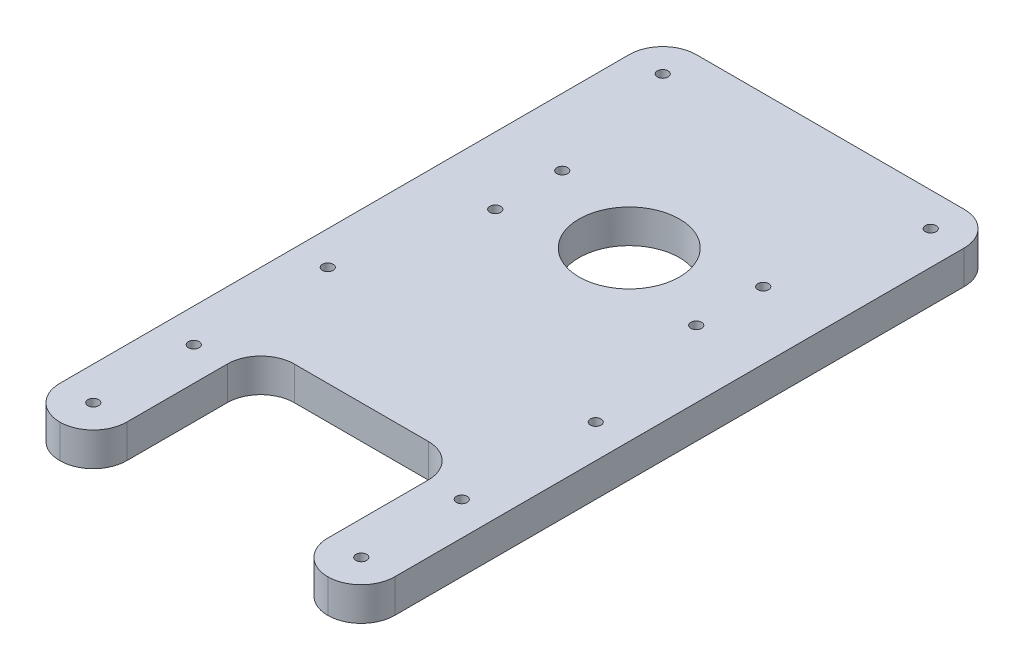
ISO-10303-21;
HEADER;
FILE_DESCRIPTION(('STEP AP214'),'2;1');
FILE_NAME('part.step','',(''),(''),'','','');
FILE_SCHEMA(('AUTOMOTIVE_DESIGN { 1 0 10303 214 1 1 1 1 }'));
ENDSEC;
DATA;
#1=APPLICATION_CONTEXT('core data for automotive mechanical design processes');
#2=APPLICATION_PROTOCOL_DEFINITION('international standard','automotive_design',2000,#1);
#3=PRODUCT_CONTEXT('',#1,'mechanical');
#4=PRODUCT('Part','Part','',(#3));
#5=PRODUCT_RELATED_PRODUCT_CATEGORY('part','',(#4));
#6=PRODUCT_DEFINITION_FORMATION('','',#4);
#7=PRODUCT_DEFINITION_CONTEXT('part definition',#1,'design');
#8=PRODUCT_DEFINITION('design','',#6,#7);
#9=PRODUCT_DEFINITION_SHAPE('','',#8);
#10=(LENGTH_UNIT() NAMED_UNIT(*) SI_UNIT(.MILLI.,.METRE.));
#11=(NAMED_UNIT(*) PLANE_ANGLE_UNIT() SI_UNIT($,.RADIAN.));
#12=(NAMED_UNIT(*) SI_UNIT($,.STERADIAN.) SOLID_ANGLE_UNIT());
#13=UNCERTAINTY_MEASURE_WITH_UNIT(LENGTH_MEASURE(1.E-05),#10,'distance_accuracy_value','');
#14=(GEOMETRIC_REPRESENTATION_CONTEXT(3) GLOBAL_UNCERTAINTY_ASSIGNED_CONTEXT((#13)) GLOBAL_UNIT_ASSIGNED_CONTEXT((#10,
#11,#12)) REPRESENTATION_CONTEXT('',''));
#15=CARTESIAN_POINT('',(0.,0.,0.));
#16=DIRECTION('',(0.,0.,1.));
#17=DIRECTION('',(1.,0.,0.));
#18=AXIS2_PLACEMENT_3D('',#15,#16,#17);
#19=CARTESIAN_POINT('',(50.,10.,-60.));
#20=DIRECTION('',(-1.,0.,0.));
#21=DIRECTION('',(0.,0.,1.));
#22=AXIS2_PLACEMENT_3D('',#19,#20,#21);
#23=PLANE('',#22);
#24=DIRECTION('',(0.,0.,-1.));
#25=VECTOR('',#24,1.);
#26=CARTESIAN_POINT('',(50.,0.,-60.));
#27=LINE('',#26,#25);
#28=CARTESIAN_POINT('',(50.,0.,120.));
#29=VERTEX_POINT('',#28);
#30=CARTESIAN_POINT('',(50.,0.,-50.));
#31=VERTEX_POINT('',#30);
#32=EDGE_CURVE('E376',#29,#31,#27,.T.);
#33=ORIENTED_EDGE('',*,*,#32,.T.);
#34=DIRECTION('',(0.,-1.,0.));
#35=VECTOR('',#34,1.);
#36=CARTESIAN_POINT('',(50.,10.,-50.));
#37=LINE('',#36,#35);
#38=CARTESIAN_POINT('',(50.,10.,-50.));
#39=VERTEX_POINT('',#38);
#40=EDGE_CURVE('E227',#31,#39,#37,.F.);
#41=ORIENTED_EDGE('',*,*,#40,.T.);
#42=DIRECTION('',(0.,0.,-1.));
#43=VECTOR('',#42,1.);
#44=CARTESIAN_POINT('',(50.,10.,130.));
#45=LINE('',#44,#43);
#46=CARTESIAN_POINT('',(50.,10.,120.));
#47=VERTEX_POINT('',#46);
#48=EDGE_CURVE('E377',#47,#39,#45,.T.);
#49=ORIENTED_EDGE('',*,*,#48,.F.);
#50=DIRECTION('',(0.,-1.,0.));
#51=VECTOR('',#50,1.);
#52=CARTESIAN_POINT('',(50.,10.,120.));
#53=LINE('',#52,#51);
#54=EDGE_CURVE('E223',#47,#29,#53,.T.);
#55=ORIENTED_EDGE('',*,*,#54,.T.);
#56=EDGE_LOOP('',(#33,#41,#49,#55));
#57=FACE_BOUND('',#56,.T.);
#58=ADVANCED_FACE('F47',(#57),#23,.F.);
#59=CARTESIAN_POINT('',(-50.,10.,-60.));
#60=DIRECTION('',(0.,0.,1.));
#61=DIRECTION('',(1.,0.,0.));
#62=AXIS2_PLACEMENT_3D('',#59,#60,#61);
#63=PLANE('',#62);
#64=DIRECTION('',(-1.,0.,0.));
#65=VECTOR('',#64,1.);
#66=CARTESIAN_POINT('',(-50.,10.,-60.));
#67=LINE('',#66,#65);
#68=CARTESIAN_POINT('',(40.,10.,-60.));
#69=VERTEX_POINT('',#68);
#70=CARTESIAN_POINT('',(-40.,10.,-60.));
#71=VERTEX_POINT('',#70);
#72=EDGE_CURVE('E381',#69,#71,#67,.T.);
#73=ORIENTED_EDGE('',*,*,#72,.F.);
#74=DIRECTION('',(0.,-1.,0.));
#75=VECTOR('',#74,1.);
#76=CARTESIAN_POINT('',(40.,10.,-60.));
#77=LINE('',#76,#75);
#78=CARTESIAN_POINT('',(40.,0.,-60.));
#79=VERTEX_POINT('',#78);
#80=EDGE_CURVE('E201',#69,#79,#77,.T.);
#81=ORIENTED_EDGE('',*,*,#80,.T.);
#82=DIRECTION('',(-1.,0.,0.));
#83=VECTOR('',#82,1.);
#84=CARTESIAN_POINT('',(-50.,0.,-60.));
#85=LINE('',#84,#83);
#86=CARTESIAN_POINT('',(-40.,0.,-60.));
#87=VERTEX_POINT('',#86);
#88=EDGE_CURVE('E391',#79,#87,#85,.T.);
#89=ORIENTED_EDGE('',*,*,#88,.T.);
#90=DIRECTION('',(0.,-1.,0.));
#91=VECTOR('',#90,1.);
#92=CARTESIAN_POINT('',(-40.,10.,-60.));
#93=LINE('',#92,#91);
#94=EDGE_CURVE('E198',#87,#71,#93,.F.);
#95=ORIENTED_EDGE('',*,*,#94,.T.);
#96=EDGE_LOOP('',(#73,#81,#89,#95));
#97=FACE_BOUND('',#96,.T.);
#98=ADVANCED_FACE('F424',(#97),#63,.F.);
#99=CARTESIAN_POINT('',(-50.,10.,60.));
#100=DIRECTION('',(1.,0.,0.));
#101=DIRECTION('',(0.,0.,-1.));
#102=AXIS2_PLACEMENT_3D('',#99,#100,#101);
#103=PLANE('',#102);
#104=DIRECTION('',(0.,0.,1.));
#105=VECTOR('',#104,1.);
#106=CARTESIAN_POINT('',(-50.,10.,-60.));
#107=LINE('',#106,#105);
#108=CARTESIAN_POINT('',(-50.,10.,-50.));
#109=VERTEX_POINT('',#108);
#110=CARTESIAN_POINT('',(-50.,10.,120.));
#111=VERTEX_POINT('',#110);
#112=EDGE_CURVE('E185',#109,#111,#107,.T.);
#113=ORIENTED_EDGE('',*,*,#112,.F.);
#114=DIRECTION('',(0.,-1.,0.));
#115=VECTOR('',#114,1.);
#116=CARTESIAN_POINT('',(-50.,10.,-50.));
#117=LINE('',#116,#115);
#118=CARTESIAN_POINT('',(-50.,0.,-50.));
#119=VERTEX_POINT('',#118);
#120=EDGE_CURVE('E250',#109,#119,#117,.T.);
#121=ORIENTED_EDGE('',*,*,#120,.T.);
#122=DIRECTION('',(0.,0.,1.));
#123=VECTOR('',#122,1.);
#124=CARTESIAN_POINT('',(-50.,0.,60.));
#125=LINE('',#124,#123);
#126=CARTESIAN_POINT('',(-50.,0.,120.));
#127=VERTEX_POINT('',#126);
#128=EDGE_CURVE('E382',#119,#127,#125,.T.);
#129=ORIENTED_EDGE('',*,*,#128,.T.);
#130=DIRECTION('',(0.,-1.,0.));
#131=VECTOR('',#130,1.);
#132=CARTESIAN_POINT('',(-50.,10.,120.));
#133=LINE('',#132,#131);
#134=EDGE_CURVE('E247',#127,#111,#133,.F.);
#135=ORIENTED_EDGE('',*,*,#134,.T.);
#136=EDGE_LOOP('',(#113,#121,#129,#135));
#137=FACE_BOUND('',#136,.T.);
#138=ADVANCED_FACE('F399',(#137),#103,.F.);
#139=CARTESIAN_POINT('',(0.,10.,0.));
#140=DIRECTION('',(0.,-1.,0.));
#141=DIRECTION('',(0.,0.,-1.));
#142=AXIS2_PLACEMENT_3D('',#139,#140,#141);
#143=PLANE('',#142);
#144=CARTESIAN_POINT('',(-30.,10.,10.));
#145=DIRECTION('',(0.,-1.,0.));
#146=DIRECTION('',(0.,0.,-1.));
#147=AXIS2_PLACEMENT_3D('',#144,#145,#146);
#148=CIRCLE('',#147,1.6);
#149=CARTESIAN_POINT('',(-30.,10.,8.4));
#150=VERTEX_POINT('',#149);
#151=EDGE_CURVE('E283',#150,#150,#148,.T.);
#152=ORIENTED_EDGE('',*,*,#151,.T.);
#153=EDGE_LOOP('',(#152));
#154=FACE_BOUND('',#153,.T.);
#155=CARTESIAN_POINT('',(30.,10.,-10.));
#156=DIRECTION('',(0.,-1.,0.));
#157=DIRECTION('',(0.,0.,-1.));
#158=AXIS2_PLACEMENT_3D('',#155,#156,#157);
#159=CIRCLE('',#158,1.6);
#160=CARTESIAN_POINT('',(30.,10.,-11.6));
#161=VERTEX_POINT('',#160);
#162=EDGE_CURVE('E287',#161,#161,#159,.T.);
#163=ORIENTED_EDGE('',*,*,#162,.T.);
#164=EDGE_LOOP('',(#163));
#165=FACE_BOUND('',#164,.T.);
#166=CARTESIAN_POINT('',(30.,10.,10.));
#167=DIRECTION('',(0.,-1.,0.));
#168=DIRECTION('',(0.,0.,-1.));
#169=AXIS2_PLACEMENT_3D('',#166,#167,#168);
#170=CIRCLE('',#169,1.6);
#171=CARTESIAN_POINT('',(30.,10.,8.4));
#172=VERTEX_POINT('',#171);
#173=EDGE_CURVE('E687',#172,#172,#170,.T.);
#174=ORIENTED_EDGE('',*,*,#173,.T.);
#175=EDGE_LOOP('',(#174));
#176=FACE_BOUND('',#175,.T.);
#177=CARTESIAN_POINT('',(-30.,10.,-10.));
#178=DIRECTION('',(0.,-1.,0.));
#179=DIRECTION('',(0.,0.,-1.));
#180=AXIS2_PLACEMENT_3D('',#177,#178,#179);
#181=CIRCLE('',#180,1.6);
#182=CARTESIAN_POINT('',(-30.,10.,-11.6));
#183=VERTEX_POINT('',#182);
#184=EDGE_CURVE('E691',#183,#183,#181,.T.);
#185=ORIENTED_EDGE('',*,*,#184,.T.);
#186=EDGE_LOOP('',(#185));
#187=FACE_BOUND('',#186,.T.);
#188=CARTESIAN_POINT('',(40.,10.,90.));
#189=DIRECTION('',(0.,-1.,0.));
#190=DIRECTION('',(0.,0.,-1.));
#191=AXIS2_PLACEMENT_3D('',#188,#189,#190);
#192=CIRCLE('',#191,1.6);
#193=CARTESIAN_POINT('',(40.,10.,88.4));
#194=VERTEX_POINT('',#193);
#195=EDGE_CURVE('E372',#194,#194,#192,.T.);
#196=ORIENTED_EDGE('',*,*,#195,.T.);
#197=EDGE_LOOP('',(#196));
#198=FACE_BOUND('',#197,.T.);
#199=CARTESIAN_POINT('',(-40.,10.,90.));
#200=DIRECTION('',(0.,-1.,0.));
#201=DIRECTION('',(0.,0.,-1.));
#202=AXIS2_PLACEMENT_3D('',#199,#200,#201);
#203=CIRCLE('',#202,1.6);
#204=CARTESIAN_POINT('',(-40.,10.,88.4));
#205=VERTEX_POINT('',#204);
#206=EDGE_CURVE('E368',#205,#205,#203,.T.);
#207=ORIENTED_EDGE('',*,*,#206,.T.);
#208=EDGE_LOOP('',(#207));
#209=FACE_BOUND('',#208,.T.);
#210=CARTESIAN_POINT('',(40.,10.,120.));
#211=DIRECTION('',(0.,-1.,0.));
#212=DIRECTION('',(0.,0.,-1.));
#213=AXIS2_PLACEMENT_3D('',#210,#211,#212);
#214=CIRCLE('',#213,1.6);
#215=CARTESIAN_POINT('',(40.,10.,118.4));
#216=VERTEX_POINT('',#215);
#217=EDGE_CURVE('E364',#216,#216,#214,.T.);
#218=ORIENTED_EDGE('',*,*,#217,.T.);
#219=EDGE_LOOP('',(#218));
#220=FACE_BOUND('',#219,.T.);
#221=CARTESIAN_POINT('',(-40.,10.,120.));
#222=DIRECTION('',(0.,-1.,0.));
#223=DIRECTION('',(0.,0.,-1.));
#224=AXIS2_PLACEMENT_3D('',#221,#222,#223);
#225=CIRCLE('',#224,1.6);
#226=CARTESIAN_POINT('',(-40.,10.,118.4));
#227=VERTEX_POINT('',#226);
#228=EDGE_CURVE('E360',#227,#227,#225,.T.);
#229=ORIENTED_EDGE('',*,*,#228,.T.);
#230=EDGE_LOOP('',(#229));
#231=FACE_BOUND('',#230,.T.);
#232=CARTESIAN_POINT('',(-40.,10.,-50.));
#233=DIRECTION('',(0.,-1.,0.));
#234=DIRECTION('',(0.,0.,-1.));
#235=AXIS2_PLACEMENT_3D('',#232,#233,#234);
#236=CIRCLE('',#235,1.6);
#237=CARTESIAN_POINT('',(-40.,10.,-51.6));
#238=VERTEX_POINT('',#237);
#239=EDGE_CURVE('E356',#238,#238,#236,.T.);
#240=ORIENTED_EDGE('',*,*,#239,.T.);
#241=EDGE_LOOP('',(#240));
#242=FACE_BOUND('',#241,.T.);
#243=CARTESIAN_POINT('',(40.,10.,-50.));
#244=DIRECTION('',(0.,-1.,0.));
#245=DIRECTION('',(0.,0.,-1.));
#246=AXIS2_PLACEMENT_3D('',#243,#244,#245);
#247=CIRCLE('',#246,1.6);
#248=CARTESIAN_POINT('',(40.,10.,-51.6));
#249=VERTEX_POINT('',#248);
#250=EDGE_CURVE('E352',#249,#249,#247,.T.);
#251=ORIENTED_EDGE('',*,*,#250,.T.);
#252=EDGE_LOOP('',(#251));
#253=FACE_BOUND('',#252,.T.);
#254=CARTESIAN_POINT('',(40.,10.,50.));
#255=DIRECTION('',(0.,-1.,0.));
#256=DIRECTION('',(0.,0.,-1.));
#257=AXIS2_PLACEMENT_3D('',#254,#255,#256);
#258=CIRCLE('',#257,1.6);
#259=CARTESIAN_POINT('',(40.,10.,48.4));
#260=VERTEX_POINT('',#259);
#261=EDGE_CURVE('E348',#260,#260,#258,.T.);
#262=ORIENTED_EDGE('',*,*,#261,.T.);
#263=EDGE_LOOP('',(#262));
#264=FACE_BOUND('',#263,.T.);
#265=CARTESIAN_POINT('',(-40.,10.,50.));
#266=DIRECTION('',(0.,-1.,0.));
#267=DIRECTION('',(0.,0.,-1.));
#268=AXIS2_PLACEMENT_3D('',#265,#266,#267);
#269=CIRCLE('',#268,1.6);
#270=CARTESIAN_POINT('',(-40.,10.,48.4));
#271=VERTEX_POINT('',#270);
#272=EDGE_CURVE('E344',#271,#271,#269,.T.);
#273=ORIENTED_EDGE('',*,*,#272,.T.);
#274=EDGE_LOOP('',(#273));
#275=FACE_BOUND('',#274,.T.);
#276=CARTESIAN_POINT('',(0.,10.,0.));
#277=DIRECTION('',(0.,-1.,0.));
#278=DIRECTION('',(0.,0.,-1.));
#279=AXIS2_PLACEMENT_3D('',#276,#277,#278);
#280=CIRCLE('',#279,15.);
#281=CARTESIAN_POINT('',(0.,10.,-15.));
#282=VERTEX_POINT('',#281);
#283=EDGE_CURVE('E340',#282,#282,#280,.T.);
#284=ORIENTED_EDGE('',*,*,#283,.T.);
#285=EDGE_LOOP('',(#284));
#286=FACE_BOUND('',#285,.T.);
#287=ORIENTED_EDGE('',*,*,#48,.T.);
#288=CARTESIAN_POINT('',(40.,10.,-50.));
#289=DIRECTION('',(0.,-1.,0.));
#290=DIRECTION('',(0.,0.,-1.));
#291=AXIS2_PLACEMENT_3D('',#288,#289,#290);
#292=CIRCLE('',#291,10.);
#293=EDGE_CURVE('E244',#39,#69,#292,.F.);
#294=ORIENTED_EDGE('',*,*,#293,.T.);
#295=ORIENTED_EDGE('',*,*,#72,.T.);
#296=CARTESIAN_POINT('',(-40.,10.,-50.));
#297=DIRECTION('',(0.,-1.,0.));
#298=DIRECTION('',(0.,0.,-1.));
#299=AXIS2_PLACEMENT_3D('',#296,#297,#298);
#300=CIRCLE('',#299,10.);
#301=EDGE_CURVE('E241',#71,#109,#300,.F.);
#302=ORIENTED_EDGE('',*,*,#301,.T.);
#303=ORIENTED_EDGE('',*,*,#112,.T.);
#304=CARTESIAN_POINT('',(-40.,10.,120.));
#305=DIRECTION('',(0.,-1.,0.));
#306=DIRECTION('',(0.,0.,-1.));
#307=AXIS2_PLACEMENT_3D('',#304,#305,#306);
#308=CIRCLE('',#307,10.);
#309=CARTESIAN_POINT('',(-40.,10.,130.));
#310=VERTEX_POINT('',#309);
#311=EDGE_CURVE('E65',#111,#310,#308,.F.);
#312=ORIENTED_EDGE('',*,*,#311,.T.);
#313=CARTESIAN_POINT('',(-40.,10.,120.));
#314=DIRECTION('',(0.,-1.,0.));
#315=DIRECTION('',(0.,0.,-1.));
#316=AXIS2_PLACEMENT_3D('',#313,#314,#315);
#317=CIRCLE('',#316,10.);
#318=CARTESIAN_POINT('',(-30.,10.,120.));
#319=VERTEX_POINT('',#318);
#320=EDGE_CURVE('E236',#310,#319,#317,.F.);
#321=ORIENTED_EDGE('',*,*,#320,.T.);
#322=DIRECTION('',(0.,0.,-1.));
#323=VECTOR('',#322,1.);
#324=CARTESIAN_POINT('',(-30.,10.,0.));
#325=LINE('',#324,#323);
#326=CARTESIAN_POINT('',(-30.,10.,90.));
#327=VERTEX_POINT('',#326);
#328=EDGE_CURVE('E297',#319,#327,#325,.T.);
#329=ORIENTED_EDGE('',*,*,#328,.T.);
#330=CARTESIAN_POINT('',(-20.,10.,90.));
#331=DIRECTION('',(0.,-1.,0.));
#332=DIRECTION('',(0.,0.,-1.));
#333=AXIS2_PLACEMENT_3D('',#330,#331,#332);
#334=CIRCLE('',#333,10.);
#335=CARTESIAN_POINT('',(-20.,10.,80.));
#336=VERTEX_POINT('',#335);
#337=EDGE_CURVE('E57',#327,#336,#334,.T.);
#338=ORIENTED_EDGE('',*,*,#337,.T.);
#339=DIRECTION('',(1.,0.,0.));
#340=VECTOR('',#339,1.);
#341=CARTESIAN_POINT('',(0.,10.,80.));
#342=LINE('',#341,#340);
#343=CARTESIAN_POINT('',(20.,10.,80.));
#344=VERTEX_POINT('',#343);
#345=EDGE_CURVE('E294',#336,#344,#342,.T.);
#346=ORIENTED_EDGE('',*,*,#345,.T.);
#347=CARTESIAN_POINT('',(20.,10.,90.));
#348=DIRECTION('',(0.,-1.,0.));
#349=DIRECTION('',(0.,0.,-1.));
#350=AXIS2_PLACEMENT_3D('',#347,#348,#349);
#351=CIRCLE('',#350,10.);
#352=CARTESIAN_POINT('',(30.,10.,90.));
#353=VERTEX_POINT('',#352);
#354=EDGE_CURVE('E164',#344,#353,#351,.T.);
#355=ORIENTED_EDGE('',*,*,#354,.T.);
#356=DIRECTION('',(0.,0.,1.));
#357=VECTOR('',#356,1.);
#358=CARTESIAN_POINT('',(30.,10.,0.));
#359=LINE('',#358,#357);
#360=CARTESIAN_POINT('',(30.,10.,120.));
#361=VERTEX_POINT('',#360);
#362=EDGE_CURVE('E301',#353,#361,#359,.T.);
#363=ORIENTED_EDGE('',*,*,#362,.T.);
#364=CARTESIAN_POINT('',(40.,10.,120.));
#365=DIRECTION('',(0.,-1.,0.));
#366=DIRECTION('',(0.,0.,-1.));
#367=AXIS2_PLACEMENT_3D('',#364,#365,#366);
#368=CIRCLE('',#367,10.);
#369=CARTESIAN_POINT('',(40.,10.,130.));
#370=VERTEX_POINT('',#369);
#371=EDGE_CURVE('E230',#361,#370,#368,.F.);
#372=ORIENTED_EDGE('',*,*,#371,.T.);
#373=CARTESIAN_POINT('',(40.,10.,120.));
#374=DIRECTION('',(0.,-1.,0.));
#375=DIRECTION('',(0.,0.,-1.));
#376=AXIS2_PLACEMENT_3D('',#373,#374,#375);
#377=CIRCLE('',#376,10.);
#378=EDGE_CURVE('E233',#370,#47,#377,.F.);
#379=ORIENTED_EDGE('',*,*,#378,.T.);
#380=EDGE_LOOP('',(#287,#294,#295,#302,#303,#312,#321,#329,#338,#346,#355,#363,#372,#379));
#381=FACE_BOUND('',#380,.T.);
#382=ADVANCED_FACE('F408',(#154,#165,#176,#187,#198,#209,#220,#231,#242,#253,#264,#275,#286,
#381),#143,.F.);
#383=CARTESIAN_POINT('',(0.,0.,0.));
#384=DIRECTION('',(0.,-1.,0.));
#385=DIRECTION('',(0.,0.,-1.));
#386=AXIS2_PLACEMENT_3D('',#383,#384,#385);
#387=PLANE('',#386);
#388=CARTESIAN_POINT('',(-30.,0.,10.));
#389=DIRECTION('',(0.,1.,0.));
#390=DIRECTION('',(0.,0.,1.));
#391=AXIS2_PLACEMENT_3D('',#388,#389,#390);
#392=CIRCLE('',#391,1.6);
#393=CARTESIAN_POINT('',(-30.,0.,11.6));
#394=VERTEX_POINT('',#393);
#395=EDGE_CURVE('E726',#394,#394,#392,.T.);
#396=ORIENTED_EDGE('',*,*,#395,.T.);
#397=EDGE_LOOP('',(#396));
#398=FACE_BOUND('',#397,.T.);
#399=CARTESIAN_POINT('',(30.,0.,-10.));
#400=DIRECTION('',(0.,1.,0.));
#401=DIRECTION('',(0.,0.,1.));
#402=AXIS2_PLACEMENT_3D('',#399,#400,#401);
#403=CIRCLE('',#402,1.6);
#404=CARTESIAN_POINT('',(30.,0.,-8.4));
#405=VERTEX_POINT('',#404);
#406=EDGE_CURVE('E265',#405,#405,#403,.T.);
#407=ORIENTED_EDGE('',*,*,#406,.T.);
#408=EDGE_LOOP('',(#407));
#409=FACE_BOUND('',#408,.T.);
#410=CARTESIAN_POINT('',(30.,0.,10.));
#411=DIRECTION('',(0.,1.,0.));
#412=DIRECTION('',(0.,0.,1.));
#413=AXIS2_PLACEMENT_3D('',#410,#411,#412);
#414=CIRCLE('',#413,1.6);
#415=CARTESIAN_POINT('',(30.,0.,11.6));
#416=VERTEX_POINT('',#415);
#417=EDGE_CURVE('E259',#416,#416,#414,.T.);
#418=ORIENTED_EDGE('',*,*,#417,.T.);
#419=EDGE_LOOP('',(#418));
#420=FACE_BOUND('',#419,.T.);
#421=CARTESIAN_POINT('',(-30.,0.,-10.));
#422=DIRECTION('',(0.,1.,0.));
#423=DIRECTION('',(0.,0.,1.));
#424=AXIS2_PLACEMENT_3D('',#421,#422,#423);
#425=CIRCLE('',#424,1.6);
#426=CARTESIAN_POINT('',(-30.,0.,-8.4));
#427=VERTEX_POINT('',#426);
#428=EDGE_CURVE('E720',#427,#427,#425,.T.);
#429=ORIENTED_EDGE('',*,*,#428,.T.);
#430=EDGE_LOOP('',(#429));
#431=FACE_BOUND('',#430,.T.);
#432=ORIENTED_EDGE('',*,*,#88,.F.);
#433=CARTESIAN_POINT('',(40.,0.,-50.));
#434=DIRECTION('',(0.,-1.,0.));
#435=DIRECTION('',(0.,0.,-1.));
#436=AXIS2_PLACEMENT_3D('',#433,#434,#435);
#437=CIRCLE('',#436,10.);
#438=EDGE_CURVE('E220',#79,#31,#437,.T.);
#439=ORIENTED_EDGE('',*,*,#438,.T.);
#440=ORIENTED_EDGE('',*,*,#32,.F.);
#441=CARTESIAN_POINT('',(40.,0.,120.));
#442=DIRECTION('',(0.,-1.,0.));
#443=DIRECTION('',(0.,0.,-1.));
#444=AXIS2_PLACEMENT_3D('',#441,#442,#443);
#445=CIRCLE('',#444,10.);
#446=CARTESIAN_POINT('',(40.,0.,130.));
#447=VERTEX_POINT('',#446);
#448=EDGE_CURVE('E208',#29,#447,#445,.T.);
#449=ORIENTED_EDGE('',*,*,#448,.T.);
#450=CARTESIAN_POINT('',(40.,0.,120.));
#451=DIRECTION('',(0.,-1.,0.));
#452=DIRECTION('',(0.,0.,-1.));
#453=AXIS2_PLACEMENT_3D('',#450,#451,#452);
#454=CIRCLE('',#453,10.);
#455=CARTESIAN_POINT('',(30.,0.,120.));
#456=VERTEX_POINT('',#455);
#457=EDGE_CURVE('E205',#447,#456,#454,.T.);
#458=ORIENTED_EDGE('',*,*,#457,.T.);
#459=DIRECTION('',(0.,0.,-1.));
#460=VECTOR('',#459,1.);
#461=CARTESIAN_POINT('',(30.,0.,130.));
#462=LINE('',#461,#460);
#463=CARTESIAN_POINT('',(30.,0.,90.));
#464=VERTEX_POINT('',#463);
#465=EDGE_CURVE('E159',#456,#464,#462,.T.);
#466=ORIENTED_EDGE('',*,*,#465,.T.);
#467=CARTESIAN_POINT('',(20.,0.,90.));
#468=DIRECTION('',(0.,-1.,0.));
#469=DIRECTION('',(0.,0.,-1.));
#470=AXIS2_PLACEMENT_3D('',#467,#468,#469);
#471=CIRCLE('',#470,10.);
#472=CARTESIAN_POINT('',(20.,0.,80.));
#473=VERTEX_POINT('',#472);
#474=EDGE_CURVE('E151',#464,#473,#471,.F.);
#475=ORIENTED_EDGE('',*,*,#474,.T.);
#476=DIRECTION('',(-1.,0.,0.));
#477=VECTOR('',#476,1.);
#478=CARTESIAN_POINT('',(-30.,0.,80.));
#479=LINE('',#478,#477);
#480=CARTESIAN_POINT('',(-20.,0.,80.));
#481=VERTEX_POINT('',#480);
#482=EDGE_CURVE('E156',#473,#481,#479,.T.);
#483=ORIENTED_EDGE('',*,*,#482,.T.);
#484=CARTESIAN_POINT('',(-20.,0.,90.));
#485=DIRECTION('',(0.,-1.,0.));
#486=DIRECTION('',(0.,0.,-1.));
#487=AXIS2_PLACEMENT_3D('',#484,#485,#486);
#488=CIRCLE('',#487,10.);
#489=CARTESIAN_POINT('',(-30.,0.,90.));
#490=VERTEX_POINT('',#489);
#491=EDGE_CURVE('E11',#481,#490,#488,.F.);
#492=ORIENTED_EDGE('',*,*,#491,.T.);
#493=DIRECTION('',(0.,0.,1.));
#494=VECTOR('',#493,1.);
#495=CARTESIAN_POINT('',(-30.,0.,130.));
#496=LINE('',#495,#494);
#497=CARTESIAN_POINT('',(-30.,0.,120.));
#498=VERTEX_POINT('',#497);
#499=EDGE_CURVE('E175',#490,#498,#496,.T.);
#500=ORIENTED_EDGE('',*,*,#499,.T.);
#501=CARTESIAN_POINT('',(-40.,0.,120.));
#502=DIRECTION('',(0.,-1.,0.));
#503=DIRECTION('',(0.,0.,-1.));
#504=AXIS2_PLACEMENT_3D('',#501,#502,#503);
#505=CIRCLE('',#504,10.);
#506=CARTESIAN_POINT('',(-40.,0.,130.));
#507=VERTEX_POINT('',#506);
#508=EDGE_CURVE('E211',#498,#507,#505,.T.);
#509=ORIENTED_EDGE('',*,*,#508,.T.);
#510=CARTESIAN_POINT('',(-40.,0.,120.));
#511=DIRECTION('',(0.,-1.,0.));
#512=DIRECTION('',(0.,0.,-1.));
#513=AXIS2_PLACEMENT_3D('',#510,#511,#512);
#514=CIRCLE('',#513,10.);
#515=EDGE_CURVE('E214',#507,#127,#514,.T.);
#516=ORIENTED_EDGE('',*,*,#515,.T.);
#517=ORIENTED_EDGE('',*,*,#128,.F.);
#518=CARTESIAN_POINT('',(-40.,0.,-50.));
#519=DIRECTION('',(0.,-1.,0.));
#520=DIRECTION('',(0.,0.,-1.));
#521=AXIS2_PLACEMENT_3D('',#518,#519,#520);
#522=CIRCLE('',#521,10.);
#523=EDGE_CURVE('E217',#119,#87,#522,.T.);
#524=ORIENTED_EDGE('',*,*,#523,.T.);
#525=EDGE_LOOP('',(#432,#439,#440,#449,#458,#466,#475,#483,#492,#500,#509,#516,#517,#524));
#526=FACE_BOUND('',#525,.T.);
#527=CARTESIAN_POINT('',(40.,0.,90.));
#528=DIRECTION('',(0.,1.,0.));
#529=DIRECTION('',(0.,0.,1.));
#530=AXIS2_PLACEMENT_3D('',#527,#528,#529);
#531=CIRCLE('',#530,1.6);
#532=CARTESIAN_POINT('',(40.,0.,91.6));
#533=VERTEX_POINT('',#532);
#534=EDGE_CURVE('E304',#533,#533,#531,.T.);
#535=ORIENTED_EDGE('',*,*,#534,.T.);
#536=EDGE_LOOP('',(#535));
#537=FACE_BOUND('',#536,.T.);
#538=CARTESIAN_POINT('',(-40.,0.,90.));
#539=DIRECTION('',(0.,1.,0.));
#540=DIRECTION('',(0.,0.,1.));
#541=AXIS2_PLACEMENT_3D('',#538,#539,#540);
#542=CIRCLE('',#541,1.6);
#543=CARTESIAN_POINT('',(-40.,0.,91.6));
#544=VERTEX_POINT('',#543);
#545=EDGE_CURVE('E330',#544,#544,#542,.T.);
#546=ORIENTED_EDGE('',*,*,#545,.T.);
#547=EDGE_LOOP('',(#546));
#548=FACE_BOUND('',#547,.T.);
#549=CARTESIAN_POINT('',(40.,0.,120.));
#550=DIRECTION('',(0.,1.,0.));
#551=DIRECTION('',(0.,0.,1.));
#552=AXIS2_PLACEMENT_3D('',#549,#550,#551);
#553=CIRCLE('',#552,1.6);
#554=CARTESIAN_POINT('',(40.,0.,121.6));
#555=VERTEX_POINT('',#554);
#556=EDGE_CURVE('E326',#555,#555,#553,.T.);
#557=ORIENTED_EDGE('',*,*,#556,.T.);
#558=EDGE_LOOP('',(#557));
#559=FACE_BOUND('',#558,.T.);
#560=CARTESIAN_POINT('',(-40.,0.,120.));
#561=DIRECTION('',(0.,1.,0.));
#562=DIRECTION('',(0.,0.,1.));
#563=AXIS2_PLACEMENT_3D('',#560,#561,#562);
#564=CIRCLE('',#563,1.6);
#565=CARTESIAN_POINT('',(-40.,0.,121.6));
#566=VERTEX_POINT('',#565);
#567=EDGE_CURVE('E322',#566,#566,#564,.T.);
#568=ORIENTED_EDGE('',*,*,#567,.T.);
#569=EDGE_LOOP('',(#568));
#570=FACE_BOUND('',#569,.T.);
#571=CARTESIAN_POINT('',(-40.,0.,-50.));
#572=DIRECTION('',(0.,1.,0.));
#573=DIRECTION('',(0.,0.,1.));
#574=AXIS2_PLACEMENT_3D('',#571,#572,#573);
#575=CIRCLE('',#574,1.6);
#576=CARTESIAN_POINT('',(-40.,0.,-48.4));
#577=VERTEX_POINT('',#576);
#578=EDGE_CURVE('E318',#577,#577,#575,.T.);
#579=ORIENTED_EDGE('',*,*,#578,.T.);
#580=EDGE_LOOP('',(#579));
#581=FACE_BOUND('',#580,.T.);
#582=CARTESIAN_POINT('',(40.,0.,-50.));
#583=DIRECTION('',(0.,1.,0.));
#584=DIRECTION('',(0.,0.,1.));
#585=AXIS2_PLACEMENT_3D('',#582,#583,#584);
#586=CIRCLE('',#585,1.6);
#587=CARTESIAN_POINT('',(40.,0.,-48.4));
#588=VERTEX_POINT('',#587);
#589=EDGE_CURVE('E314',#588,#588,#586,.T.);
#590=ORIENTED_EDGE('',*,*,#589,.T.);
#591=EDGE_LOOP('',(#590));
#592=FACE_BOUND('',#591,.T.);
#593=CARTESIAN_POINT('',(40.,0.,50.));
#594=DIRECTION('',(0.,1.,0.));
#595=DIRECTION('',(0.,0.,1.));
#596=AXIS2_PLACEMENT_3D('',#593,#594,#595);
#597=CIRCLE('',#596,1.6);
#598=CARTESIAN_POINT('',(40.,0.,51.6));
#599=VERTEX_POINT('',#598);
#600=EDGE_CURVE('E310',#599,#599,#597,.T.);
#601=ORIENTED_EDGE('',*,*,#600,.T.);
#602=EDGE_LOOP('',(#601));
#603=FACE_BOUND('',#602,.T.);
#604=CARTESIAN_POINT('',(-40.,0.,50.));
#605=DIRECTION('',(0.,1.,0.));
#606=DIRECTION('',(0.,0.,1.));
#607=AXIS2_PLACEMENT_3D('',#604,#605,#606);
#608=CIRCLE('',#607,1.6);
#609=CARTESIAN_POINT('',(-40.,0.,51.6));
#610=VERTEX_POINT('',#609);
#611=EDGE_CURVE('E305',#610,#610,#608,.T.);
#612=ORIENTED_EDGE('',*,*,#611,.T.);
#613=EDGE_LOOP('',(#612));
#614=FACE_BOUND('',#613,.T.);
#615=CARTESIAN_POINT('',(0.,0.,0.));
#616=DIRECTION('',(0.,1.,0.));
#617=DIRECTION('',(0.,0.,1.));
#618=AXIS2_PLACEMENT_3D('',#615,#616,#617);
#619=CIRCLE('',#618,15.);
#620=CARTESIAN_POINT('',(0.,0.,15.));
#621=VERTEX_POINT('',#620);
#622=EDGE_CURVE('E309',#621,#621,#619,.T.);
#623=ORIENTED_EDGE('',*,*,#622,.T.);
#624=EDGE_LOOP('',(#623));
#625=FACE_BOUND('',#624,.T.);
#626=ADVANCED_FACE('F154',(#398,#409,#420,#431,#526,#537,#548,#559,#570,#581,#592,#603,#614,
#625),#387,.T.);
#627=CARTESIAN_POINT('',(0.,0.,0.));
#628=DIRECTION('',(0.,1.,0.));
#629=DIRECTION('',(0.,0.,1.));
#630=AXIS2_PLACEMENT_3D('',#627,#628,#629);
#631=CYLINDRICAL_SURFACE('',#630,15.);
#632=ORIENTED_EDGE('',*,*,#622,.F.);
#633=EDGE_LOOP('',(#632));
#634=FACE_BOUND('',#633,.T.);
#635=ORIENTED_EDGE('',*,*,#283,.F.);
#636=EDGE_LOOP('',(#635));
#637=FACE_BOUND('',#636,.T.);
#638=ADVANCED_FACE('F623',(#634,#637),#631,.F.);
#639=CARTESIAN_POINT('',(-40.,0.,50.));
#640=DIRECTION('',(0.,1.,0.));
#641=DIRECTION('',(0.,0.,1.));
#642=AXIS2_PLACEMENT_3D('',#639,#640,#641);
#643=CYLINDRICAL_SURFACE('',#642,1.6);
#644=ORIENTED_EDGE('',*,*,#611,.F.);
#645=EDGE_LOOP('',(#644));
#646=FACE_BOUND('',#645,.T.);
#647=ORIENTED_EDGE('',*,*,#272,.F.);
#648=EDGE_LOOP('',(#647));
#649=FACE_BOUND('',#648,.T.);
#650=ADVANCED_FACE('F614',(#646,#649),#643,.F.);
#651=CARTESIAN_POINT('',(40.,0.,50.));
#652=DIRECTION('',(0.,1.,0.));
#653=DIRECTION('',(0.,0.,1.));
#654=AXIS2_PLACEMENT_3D('',#651,#652,#653);
#655=CYLINDRICAL_SURFACE('',#654,1.6);
#656=ORIENTED_EDGE('',*,*,#600,.F.);
#657=EDGE_LOOP('',(#656));
#658=FACE_BOUND('',#657,.T.);
#659=ORIENTED_EDGE('',*,*,#261,.F.);
#660=EDGE_LOOP('',(#659));
#661=FACE_BOUND('',#660,.T.);
#662=ADVANCED_FACE('F605',(#658,#661),#655,.F.);
#663=CARTESIAN_POINT('',(40.,0.,-50.));
#664=DIRECTION('',(0.,1.,0.));
#665=DIRECTION('',(0.,0.,1.));
#666=AXIS2_PLACEMENT_3D('',#663,#664,#665);
#667=CYLINDRICAL_SURFACE('',#666,1.6);
#668=ORIENTED_EDGE('',*,*,#589,.F.);
#669=EDGE_LOOP('',(#668));
#670=FACE_BOUND('',#669,.T.);
#671=ORIENTED_EDGE('',*,*,#250,.F.);
#672=EDGE_LOOP('',(#671));
#673=FACE_BOUND('',#672,.T.);
#674=ADVANCED_FACE('F596',(#670,#673),#667,.F.);
#675=CARTESIAN_POINT('',(-40.,0.,-50.));
#676=DIRECTION('',(0.,1.,0.));
#677=DIRECTION('',(0.,0.,1.));
#678=AXIS2_PLACEMENT_3D('',#675,#676,#677);
#679=CYLINDRICAL_SURFACE('',#678,1.6);
#680=ORIENTED_EDGE('',*,*,#578,.F.);
#681=EDGE_LOOP('',(#680));
#682=FACE_BOUND('',#681,.T.);
#683=ORIENTED_EDGE('',*,*,#239,.F.);
#684=EDGE_LOOP('',(#683));
#685=FACE_BOUND('',#684,.T.);
#686=ADVANCED_FACE('F587',(#682,#685),#679,.F.);
#687=CARTESIAN_POINT('',(-40.,0.,120.));
#688=DIRECTION('',(0.,1.,0.));
#689=DIRECTION('',(0.,0.,1.));
#690=AXIS2_PLACEMENT_3D('',#687,#688,#689);
#691=CYLINDRICAL_SURFACE('',#690,1.6);
#692=ORIENTED_EDGE('',*,*,#567,.F.);
#693=EDGE_LOOP('',(#692));
#694=FACE_BOUND('',#693,.T.);
#695=ORIENTED_EDGE('',*,*,#228,.F.);
#696=EDGE_LOOP('',(#695));
#697=FACE_BOUND('',#696,.T.);
#698=ADVANCED_FACE('F578',(#694,#697),#691,.F.);
#699=CARTESIAN_POINT('',(40.,0.,120.));
#700=DIRECTION('',(0.,1.,0.));
#701=DIRECTION('',(0.,0.,1.));
#702=AXIS2_PLACEMENT_3D('',#699,#700,#701);
#703=CYLINDRICAL_SURFACE('',#702,1.6);
#704=ORIENTED_EDGE('',*,*,#556,.F.);
#705=EDGE_LOOP('',(#704));
#706=FACE_BOUND('',#705,.T.);
#707=ORIENTED_EDGE('',*,*,#217,.F.);
#708=EDGE_LOOP('',(#707));
#709=FACE_BOUND('',#708,.T.);
#710=ADVANCED_FACE('F569',(#706,#709),#703,.F.);
#711=CARTESIAN_POINT('',(-40.,0.,90.));
#712=DIRECTION('',(0.,1.,0.));
#713=DIRECTION('',(0.,0.,1.));
#714=AXIS2_PLACEMENT_3D('',#711,#712,#713);
#715=CYLINDRICAL_SURFACE('',#714,1.6);
#716=ORIENTED_EDGE('',*,*,#545,.F.);
#717=EDGE_LOOP('',(#716));
#718=FACE_BOUND('',#717,.T.);
#719=ORIENTED_EDGE('',*,*,#206,.F.);
#720=EDGE_LOOP('',(#719));
#721=FACE_BOUND('',#720,.T.);
#722=ADVANCED_FACE('F560',(#718,#721),#715,.F.);
#723=CARTESIAN_POINT('',(40.,0.,90.));
#724=DIRECTION('',(0.,1.,0.));
#725=DIRECTION('',(0.,0.,1.));
#726=AXIS2_PLACEMENT_3D('',#723,#724,#725);
#727=CYLINDRICAL_SURFACE('',#726,1.6);
#728=ORIENTED_EDGE('',*,*,#534,.F.);
#729=EDGE_LOOP('',(#728));
#730=FACE_BOUND('',#729,.T.);
#731=ORIENTED_EDGE('',*,*,#195,.F.);
#732=EDGE_LOOP('',(#731));
#733=FACE_BOUND('',#732,.T.);
#734=ADVANCED_FACE('F552',(#730,#733),#727,.F.);
#735=CARTESIAN_POINT('',(30.,0.,130.));
#736=DIRECTION('',(1.,0.,0.));
#737=DIRECTION('',(0.,0.,-1.));
#738=AXIS2_PLACEMENT_3D('',#735,#736,#737);
#739=PLANE('',#738);
#740=ORIENTED_EDGE('',*,*,#362,.F.);
#741=DIRECTION('',(0.,1.,0.));
#742=VECTOR('',#741,1.);
#743=CARTESIAN_POINT('',(30.,0.,90.));
#744=LINE('',#743,#742);
#745=EDGE_CURVE('E183',#353,#464,#744,.F.);
#746=ORIENTED_EDGE('',*,*,#745,.T.);
#747=ORIENTED_EDGE('',*,*,#465,.F.);
#748=DIRECTION('',(0.,1.,0.));
#749=VECTOR('',#748,1.);
#750=CARTESIAN_POINT('',(30.,0.,120.));
#751=LINE('',#750,#749);
#752=EDGE_CURVE('E179',#456,#361,#751,.T.);
#753=ORIENTED_EDGE('',*,*,#752,.T.);
#754=EDGE_LOOP('',(#740,#746,#747,#753));
#755=FACE_BOUND('',#754,.T.);
#756=ADVANCED_FACE('F280',(#755),#739,.F.);
#757=CARTESIAN_POINT('',(-30.,0.,130.));
#758=DIRECTION('',(-1.,0.,0.));
#759=DIRECTION('',(0.,0.,1.));
#760=AXIS2_PLACEMENT_3D('',#757,#758,#759);
#761=PLANE('',#760);
#762=ORIENTED_EDGE('',*,*,#499,.F.);
#763=DIRECTION('',(0.,1.,0.));
#764=VECTOR('',#763,1.);
#765=CARTESIAN_POINT('',(-30.,10.,90.));
#766=LINE('',#765,#764);
#767=EDGE_CURVE('E194',#490,#327,#766,.T.);
#768=ORIENTED_EDGE('',*,*,#767,.T.);
#769=ORIENTED_EDGE('',*,*,#328,.F.);
#770=DIRECTION('',(0.,1.,0.));
#771=VECTOR('',#770,1.);
#772=CARTESIAN_POINT('',(-30.,0.,120.));
#773=LINE('',#772,#771);
#774=EDGE_CURVE('E191',#319,#498,#773,.F.);
#775=ORIENTED_EDGE('',*,*,#774,.T.);
#776=EDGE_LOOP('',(#762,#768,#769,#775));
#777=FACE_BOUND('',#776,.T.);
#778=ADVANCED_FACE('F410',(#777),#761,.F.);
#779=CARTESIAN_POINT('',(-30.,0.,80.));
#780=DIRECTION('',(0.,0.,-1.));
#781=DIRECTION('',(-1.,0.,0.));
#782=AXIS2_PLACEMENT_3D('',#779,#780,#781);
#783=PLANE('',#782);
#784=ORIENTED_EDGE('',*,*,#482,.F.);
#785=DIRECTION('',(0.,1.,0.));
#786=VECTOR('',#785,1.);
#787=CARTESIAN_POINT('',(20.,10.,80.));
#788=LINE('',#787,#786);
#789=EDGE_CURVE('E170',#473,#344,#788,.T.);
#790=ORIENTED_EDGE('',*,*,#789,.T.);
#791=ORIENTED_EDGE('',*,*,#345,.F.);
#792=DIRECTION('',(0.,1.,0.));
#793=VECTOR('',#792,1.);
#794=CARTESIAN_POINT('',(-20.,0.,80.));
#795=LINE('',#794,#793);
#796=EDGE_CURVE('E173',#336,#481,#795,.F.);
#797=ORIENTED_EDGE('',*,*,#796,.T.);
#798=EDGE_LOOP('',(#784,#790,#791,#797));
#799=FACE_BOUND('',#798,.T.);
#800=ADVANCED_FACE('F168',(#799),#783,.F.);
#801=CARTESIAN_POINT('',(-30.,0.,-10.));
#802=DIRECTION('',(0.,1.,0.));
#803=DIRECTION('',(0.,0.,1.));
#804=AXIS2_PLACEMENT_3D('',#801,#802,#803);
#805=CYLINDRICAL_SURFACE('',#804,1.6);
#806=ORIENTED_EDGE('',*,*,#428,.F.);
#807=EDGE_LOOP('',(#806));
#808=FACE_BOUND('',#807,.T.);
#809=ORIENTED_EDGE('',*,*,#184,.F.);
#810=EDGE_LOOP('',(#809));
#811=FACE_BOUND('',#810,.T.);
#812=ADVANCED_FACE('F522',(#808,#811),#805,.F.);
#813=CARTESIAN_POINT('',(30.,0.,10.));
#814=DIRECTION('',(0.,1.,0.));
#815=DIRECTION('',(0.,0.,1.));
#816=AXIS2_PLACEMENT_3D('',#813,#814,#815);
#817=CYLINDRICAL_SURFACE('',#816,1.6);
#818=ORIENTED_EDGE('',*,*,#417,.F.);
#819=EDGE_LOOP('',(#818));
#820=FACE_BOUND('',#819,.T.);
#821=ORIENTED_EDGE('',*,*,#173,.F.);
#822=EDGE_LOOP('',(#821));
#823=FACE_BOUND('',#822,.T.);
#824=ADVANCED_FACE('F513',(#820,#823),#817,.F.);
#825=CARTESIAN_POINT('',(30.,0.,-10.));
#826=DIRECTION('',(0.,1.,0.));
#827=DIRECTION('',(0.,0.,1.));
#828=AXIS2_PLACEMENT_3D('',#825,#826,#827);
#829=CYLINDRICAL_SURFACE('',#828,1.6);
#830=ORIENTED_EDGE('',*,*,#406,.F.);
#831=EDGE_LOOP('',(#830));
#832=FACE_BOUND('',#831,.T.);
#833=ORIENTED_EDGE('',*,*,#162,.F.);
#834=EDGE_LOOP('',(#833));
#835=FACE_BOUND('',#834,.T.);
#836=ADVANCED_FACE('F504',(#832,#835),#829,.F.);
#837=CARTESIAN_POINT('',(-30.,0.,10.));
#838=DIRECTION('',(0.,1.,0.));
#839=DIRECTION('',(0.,0.,1.));
#840=AXIS2_PLACEMENT_3D('',#837,#838,#839);
#841=CYLINDRICAL_SURFACE('',#840,1.6);
#842=ORIENTED_EDGE('',*,*,#395,.F.);
#843=EDGE_LOOP('',(#842));
#844=FACE_BOUND('',#843,.T.);
#845=ORIENTED_EDGE('',*,*,#151,.F.);
#846=EDGE_LOOP('',(#845));
#847=FACE_BOUND('',#846,.T.);
#848=ADVANCED_FACE('F448',(#844,#847),#841,.F.);
#849=CARTESIAN_POINT('',(20.,0.,90.));
#850=DIRECTION('',(0.,-1.,0.));
#851=DIRECTION('',(0.,0.,-1.));
#852=AXIS2_PLACEMENT_3D('',#849,#850,#851);
#853=CYLINDRICAL_SURFACE('',#852,10.);
#854=ORIENTED_EDGE('',*,*,#474,.F.);
#855=ORIENTED_EDGE('',*,*,#745,.F.);
#856=ORIENTED_EDGE('',*,*,#354,.F.);
#857=ORIENTED_EDGE('',*,*,#789,.F.);
#858=EDGE_LOOP('',(#854,#855,#856,#857));
#859=FACE_BOUND('',#858,.T.);
#860=ADVANCED_FACE('F177',(#859),#853,.F.);
#861=CARTESIAN_POINT('',(-20.,0.,90.));
#862=DIRECTION('',(0.,-1.,0.));
#863=DIRECTION('',(0.,0.,-1.));
#864=AXIS2_PLACEMENT_3D('',#861,#862,#863);
#865=CYLINDRICAL_SURFACE('',#864,10.);
#866=ORIENTED_EDGE('',*,*,#491,.F.);
#867=ORIENTED_EDGE('',*,*,#796,.F.);
#868=ORIENTED_EDGE('',*,*,#337,.F.);
#869=ORIENTED_EDGE('',*,*,#767,.F.);
#870=EDGE_LOOP('',(#866,#867,#868,#869));
#871=FACE_BOUND('',#870,.T.);
#872=ADVANCED_FACE('F413',(#871),#865,.F.);
#873=CARTESIAN_POINT('',(40.,10.,-50.));
#874=DIRECTION('',(0.,-1.,0.));
#875=DIRECTION('',(0.,0.,-1.));
#876=AXIS2_PLACEMENT_3D('',#873,#874,#875);
#877=CYLINDRICAL_SURFACE('',#876,10.);
#878=ORIENTED_EDGE('',*,*,#293,.F.);
#879=ORIENTED_EDGE('',*,*,#40,.F.);
#880=ORIENTED_EDGE('',*,*,#438,.F.);
#881=ORIENTED_EDGE('',*,*,#80,.F.);
#882=EDGE_LOOP('',(#878,#879,#880,#881));
#883=FACE_BOUND('',#882,.T.);
#884=ADVANCED_FACE('F419',(#883),#877,.T.);
#885=CARTESIAN_POINT('',(-40.,10.,-50.));
#886=DIRECTION('',(0.,-1.,0.));
#887=DIRECTION('',(0.,0.,-1.));
#888=AXIS2_PLACEMENT_3D('',#885,#886,#887);
#889=CYLINDRICAL_SURFACE('',#888,10.);
#890=ORIENTED_EDGE('',*,*,#301,.F.);
#891=ORIENTED_EDGE('',*,*,#94,.F.);
#892=ORIENTED_EDGE('',*,*,#523,.F.);
#893=ORIENTED_EDGE('',*,*,#120,.F.);
#894=EDGE_LOOP('',(#890,#891,#892,#893));
#895=FACE_BOUND('',#894,.T.);
#896=ADVANCED_FACE('F427',(#895),#889,.T.);
#897=CARTESIAN_POINT('',(-40.,10.,120.));
#898=DIRECTION('',(0.,1.,0.));
#899=DIRECTION('',(0.,0.,1.));
#900=AXIS2_PLACEMENT_3D('',#897,#898,#899);
#901=CYLINDRICAL_SURFACE('',#900,10.);
#902=ORIENTED_EDGE('',*,*,#774,.F.);
#903=ORIENTED_EDGE('',*,*,#320,.F.);
#904=DIRECTION('',(0.,1.,0.));
#905=VECTOR('',#904,1.);
#906=CARTESIAN_POINT('',(-40.,10.,130.));
#907=LINE('',#906,#905);
#908=EDGE_CURVE('E257',#507,#310,#907,.T.);
#909=ORIENTED_EDGE('',*,*,#908,.F.);
#910=ORIENTED_EDGE('',*,*,#508,.F.);
#911=EDGE_LOOP('',(#902,#903,#909,#910));
#912=FACE_BOUND('',#911,.T.);
#913=ADVANCED_FACE('F406',(#912),#901,.T.);
#914=CARTESIAN_POINT('',(-40.,10.,120.));
#915=DIRECTION('',(0.,-1.,0.));
#916=DIRECTION('',(0.,0.,-1.));
#917=AXIS2_PLACEMENT_3D('',#914,#915,#916);
#918=CYLINDRICAL_SURFACE('',#917,10.);
#919=ORIENTED_EDGE('',*,*,#311,.F.);
#920=ORIENTED_EDGE('',*,*,#134,.F.);
#921=ORIENTED_EDGE('',*,*,#515,.F.);
#922=ORIENTED_EDGE('',*,*,#908,.T.);
#923=EDGE_LOOP('',(#919,#920,#921,#922));
#924=FACE_BOUND('',#923,.T.);
#925=ADVANCED_FACE('F401',(#924),#918,.T.);
#926=CARTESIAN_POINT('',(40.,0.,120.));
#927=DIRECTION('',(0.,1.,0.));
#928=DIRECTION('',(0.,0.,1.));
#929=AXIS2_PLACEMENT_3D('',#926,#927,#928);
#930=CYLINDRICAL_SURFACE('',#929,10.);
#931=DIRECTION('',(0.,1.,0.));
#932=VECTOR('',#931,1.);
#933=CARTESIAN_POINT('',(40.,10.,130.));
#934=LINE('',#933,#932);
#935=EDGE_CURVE('E51',#370,#447,#934,.F.);
#936=ORIENTED_EDGE('',*,*,#935,.F.);
#937=ORIENTED_EDGE('',*,*,#371,.F.);
#938=ORIENTED_EDGE('',*,*,#752,.F.);
#939=ORIENTED_EDGE('',*,*,#457,.F.);
#940=EDGE_LOOP('',(#936,#937,#938,#939));
#941=FACE_BOUND('',#940,.T.);
#942=ADVANCED_FACE('F49',(#941),#930,.T.);
#943=CARTESIAN_POINT('',(40.,10.,120.));
#944=DIRECTION('',(0.,-1.,0.));
#945=DIRECTION('',(0.,0.,-1.));
#946=AXIS2_PLACEMENT_3D('',#943,#944,#945);
#947=CYLINDRICAL_SURFACE('',#946,10.);
#948=ORIENTED_EDGE('',*,*,#378,.F.);
#949=ORIENTED_EDGE('',*,*,#935,.T.);
#950=ORIENTED_EDGE('',*,*,#448,.F.);
#951=ORIENTED_EDGE('',*,*,#54,.F.);
#952=EDGE_LOOP('',(#948,#949,#950,#951));
#953=FACE_BOUND('',#952,.T.);
#954=ADVANCED_FACE('F271',(#953),#947,.T.);
#955=CLOSED_SHELL('',(#58,#98,#138,#382,#626,#638,#650,#662,#674,#686,#698,#710,#722,#734,#756,
#778,#800,#812,#824,#836,#848,#860,#872,#884,#896,#913,#925,#942,#954));
#956=MANIFOLD_SOLID_BREP('B2',#955);
#957=ADVANCED_BREP_SHAPE_REPRESENTATION('',(#18,#956),#14);
#958=SHAPE_DEFINITION_REPRESENTATION(#9,#957);
ENDSEC;
END-ISO-10303-21;
